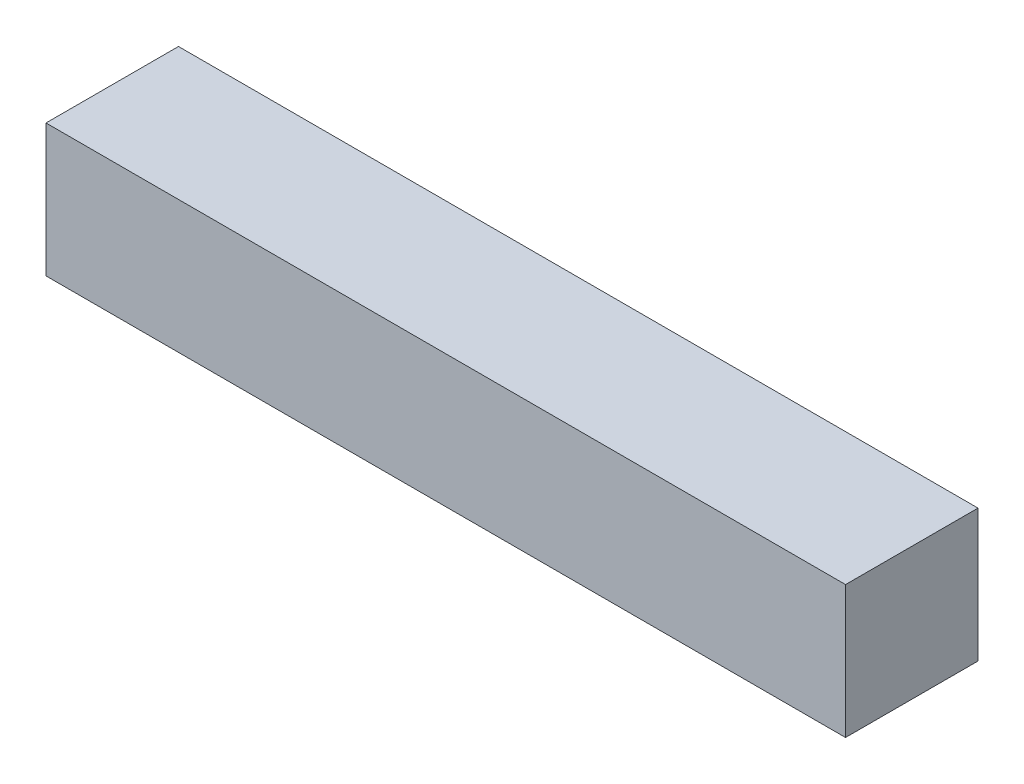
ISO-10303-21;
HEADER;
FILE_DESCRIPTION(('STEP AP214'),'2;1');
FILE_NAME('part.step','',(''),(''),'','','');
FILE_SCHEMA(('AUTOMOTIVE_DESIGN { 1 0 10303 214 1 1 1 1 }'));
ENDSEC;
DATA;
#1=APPLICATION_CONTEXT('core data for automotive mechanical design processes');
#2=APPLICATION_PROTOCOL_DEFINITION('international standard','automotive_design',2000,#1);
#3=PRODUCT_CONTEXT('',#1,'mechanical');
#4=PRODUCT('Part','Part','',(#3));
#5=PRODUCT_RELATED_PRODUCT_CATEGORY('part','',(#4));
#6=PRODUCT_DEFINITION_FORMATION('','',#4);
#7=PRODUCT_DEFINITION_CONTEXT('part definition',#1,'design');
#8=PRODUCT_DEFINITION('design','',#6,#7);
#9=PRODUCT_DEFINITION_SHAPE('','',#8);
#10=(LENGTH_UNIT() NAMED_UNIT(*) SI_UNIT(.MILLI.,.METRE.));
#11=(NAMED_UNIT(*) PLANE_ANGLE_UNIT() SI_UNIT($,.RADIAN.));
#12=(NAMED_UNIT(*) SI_UNIT($,.STERADIAN.) SOLID_ANGLE_UNIT());
#13=UNCERTAINTY_MEASURE_WITH_UNIT(LENGTH_MEASURE(1.E-05),#10,'distance_accuracy_value','');
#14=(GEOMETRIC_REPRESENTATION_CONTEXT(3) GLOBAL_UNCERTAINTY_ASSIGNED_CONTEXT((#13)) GLOBAL_UNIT_ASSIGNED_CONTEXT((#10,
#11,#12)) REPRESENTATION_CONTEXT('',''));
#15=CARTESIAN_POINT('',(0.,0.,0.));
#16=DIRECTION('',(0.,0.,1.));
#17=DIRECTION('',(1.,0.,0.));
#18=AXIS2_PLACEMENT_3D('',#15,#16,#17);
#19=CARTESIAN_POINT('',(169.,-14.,-14.));
#20=DIRECTION('',(0.,0.,1.));
#21=DIRECTION('',(1.,0.,0.));
#22=AXIS2_PLACEMENT_3D('',#19,#20,#21);
#23=PLANE('',#22);
#24=DIRECTION('',(0.,1.,0.));
#25=VECTOR('',#24,1.);
#26=CARTESIAN_POINT('',(0.,-14.,-14.));
#27=LINE('',#26,#25);
#28=CARTESIAN_POINT('',(0.,-14.,-14.));
#29=VERTEX_POINT('',#28);
#30=CARTESIAN_POINT('',(0.,14.,-14.));
#31=VERTEX_POINT('',#30);
#32=EDGE_CURVE('E107',#29,#31,#27,.T.);
#33=ORIENTED_EDGE('',*,*,#32,.T.);
#34=DIRECTION('',(-1.,0.,0.));
#35=VECTOR('',#34,1.);
#36=CARTESIAN_POINT('',(169.,14.,-14.));
#37=LINE('',#36,#35);
#38=CARTESIAN_POINT('',(169.,14.,-14.));
#39=VERTEX_POINT('',#38);
#40=EDGE_CURVE('E11',#39,#31,#37,.T.);
#41=ORIENTED_EDGE('',*,*,#40,.F.);
#42=DIRECTION('',(0.,1.,0.));
#43=VECTOR('',#42,1.);
#44=CARTESIAN_POINT('',(169.,-14.,-14.));
#45=LINE('',#44,#43);
#46=CARTESIAN_POINT('',(169.,-14.,-14.));
#47=VERTEX_POINT('',#46);
#48=EDGE_CURVE('E91',#47,#39,#45,.T.);
#49=ORIENTED_EDGE('',*,*,#48,.F.);
#50=DIRECTION('',(-1.,0.,0.));
#51=VECTOR('',#50,1.);
#52=CARTESIAN_POINT('',(169.,-14.,-14.));
#53=LINE('',#52,#51);
#54=EDGE_CURVE('E103',#47,#29,#53,.T.);
#55=ORIENTED_EDGE('',*,*,#54,.T.);
#56=EDGE_LOOP('',(#33,#41,#49,#55));
#57=FACE_BOUND('',#56,.T.);
#58=ADVANCED_FACE('F39',(#57),#23,.F.);
#59=CARTESIAN_POINT('',(169.,14.,14.));
#60=DIRECTION('',(0.,-1.,0.));
#61=DIRECTION('',(0.,0.,-1.));
#62=AXIS2_PLACEMENT_3D('',#59,#60,#61);
#63=PLANE('',#62);
#64=DIRECTION('',(0.,0.,1.));
#65=VECTOR('',#64,1.);
#66=CARTESIAN_POINT('',(0.,14.,14.));
#67=LINE('',#66,#65);
#68=CARTESIAN_POINT('',(0.,14.,14.));
#69=VERTEX_POINT('',#68);
#70=EDGE_CURVE('E96',#31,#69,#67,.T.);
#71=ORIENTED_EDGE('',*,*,#70,.T.);
#72=DIRECTION('',(-1.,0.,0.));
#73=VECTOR('',#72,1.);
#74=CARTESIAN_POINT('',(169.,14.,14.));
#75=LINE('',#74,#73);
#76=CARTESIAN_POINT('',(169.,14.,14.));
#77=VERTEX_POINT('',#76);
#78=EDGE_CURVE('E48',#77,#69,#75,.T.);
#79=ORIENTED_EDGE('',*,*,#78,.F.);
#80=DIRECTION('',(0.,0.,1.));
#81=VECTOR('',#80,1.);
#82=CARTESIAN_POINT('',(169.,14.,14.));
#83=LINE('',#82,#81);
#84=EDGE_CURVE('E86',#39,#77,#83,.T.);
#85=ORIENTED_EDGE('',*,*,#84,.F.);
#86=ORIENTED_EDGE('',*,*,#40,.T.);
#87=EDGE_LOOP('',(#71,#79,#85,#86));
#88=FACE_BOUND('',#87,.T.);
#89=ADVANCED_FACE('F95',(#88),#63,.F.);
#90=CARTESIAN_POINT('',(169.,-14.,14.));
#91=DIRECTION('',(0.,0.,-1.));
#92=DIRECTION('',(-1.,0.,0.));
#93=AXIS2_PLACEMENT_3D('',#90,#91,#92);
#94=PLANE('',#93);
#95=DIRECTION('',(0.,-1.,0.));
#96=VECTOR('',#95,1.);
#97=CARTESIAN_POINT('',(0.,-14.,14.));
#98=LINE('',#97,#96);
#99=CARTESIAN_POINT('',(0.,-14.,14.));
#100=VERTEX_POINT('',#99);
#101=EDGE_CURVE('E73',#69,#100,#98,.T.);
#102=ORIENTED_EDGE('',*,*,#101,.T.);
#103=DIRECTION('',(-1.,0.,0.));
#104=VECTOR('',#103,1.);
#105=CARTESIAN_POINT('',(169.,-14.,14.));
#106=LINE('',#105,#104);
#107=CARTESIAN_POINT('',(169.,-14.,14.));
#108=VERTEX_POINT('',#107);
#109=EDGE_CURVE('E98',#108,#100,#106,.T.);
#110=ORIENTED_EDGE('',*,*,#109,.F.);
#111=DIRECTION('',(0.,-1.,0.));
#112=VECTOR('',#111,1.);
#113=CARTESIAN_POINT('',(169.,-14.,14.));
#114=LINE('',#113,#112);
#115=EDGE_CURVE('E89',#77,#108,#114,.T.);
#116=ORIENTED_EDGE('',*,*,#115,.F.);
#117=ORIENTED_EDGE('',*,*,#78,.T.);
#118=EDGE_LOOP('',(#102,#110,#116,#117));
#119=FACE_BOUND('',#118,.T.);
#120=ADVANCED_FACE('F99',(#119),#94,.F.);
#121=CARTESIAN_POINT('',(169.,-14.,14.));
#122=DIRECTION('',(0.,1.,0.));
#123=DIRECTION('',(0.,0.,1.));
#124=AXIS2_PLACEMENT_3D('',#121,#122,#123);
#125=PLANE('',#124);
#126=DIRECTION('',(0.,0.,-1.));
#127=VECTOR('',#126,1.);
#128=CARTESIAN_POINT('',(0.,-14.,14.));
#129=LINE('',#128,#127);
#130=EDGE_CURVE('E79',#100,#29,#129,.T.);
#131=ORIENTED_EDGE('',*,*,#130,.T.);
#132=ORIENTED_EDGE('',*,*,#54,.F.);
#133=DIRECTION('',(0.,0.,-1.));
#134=VECTOR('',#133,1.);
#135=CARTESIAN_POINT('',(169.,-14.,14.));
#136=LINE('',#135,#134);
#137=EDGE_CURVE('E56',#108,#47,#136,.T.);
#138=ORIENTED_EDGE('',*,*,#137,.F.);
#139=ORIENTED_EDGE('',*,*,#109,.T.);
#140=EDGE_LOOP('',(#131,#132,#138,#139));
#141=FACE_BOUND('',#140,.T.);
#142=ADVANCED_FACE('F120',(#141),#125,.F.);
#143=CARTESIAN_POINT('',(169.,0.,0.));
#144=DIRECTION('',(-1.,0.,0.));
#145=DIRECTION('',(0.,0.,1.));
#146=AXIS2_PLACEMENT_3D('',#143,#144,#145);
#147=PLANE('',#146);
#148=ORIENTED_EDGE('',*,*,#48,.T.);
#149=ORIENTED_EDGE('',*,*,#84,.T.);
#150=ORIENTED_EDGE('',*,*,#115,.T.);
#151=ORIENTED_EDGE('',*,*,#137,.T.);
#152=EDGE_LOOP('',(#148,#149,#150,#151));
#153=FACE_BOUND('',#152,.T.);
#154=ADVANCED_FACE('F87',(#153),#147,.F.);
#155=CARTESIAN_POINT('',(0.,0.,0.));
#156=DIRECTION('',(-1.,0.,0.));
#157=DIRECTION('',(0.,0.,1.));
#158=AXIS2_PLACEMENT_3D('',#155,#156,#157);
#159=PLANE('',#158);
#160=ORIENTED_EDGE('',*,*,#32,.F.);
#161=ORIENTED_EDGE('',*,*,#130,.F.);
#162=ORIENTED_EDGE('',*,*,#101,.F.);
#163=ORIENTED_EDGE('',*,*,#70,.F.);
#164=EDGE_LOOP('',(#160,#161,#162,#163));
#165=FACE_BOUND('',#164,.T.);
#166=ADVANCED_FACE('F123',(#165),#159,.T.);
#167=CLOSED_SHELL('',(#58,#89,#120,#142,#154,#166));
#168=MANIFOLD_SOLID_BREP('B2',#167);
#169=ADVANCED_BREP_SHAPE_REPRESENTATION('',(#18,#168),#14);
#170=SHAPE_DEFINITION_REPRESENTATION(#9,#169);
ENDSEC;
END-ISO-10303-21;
